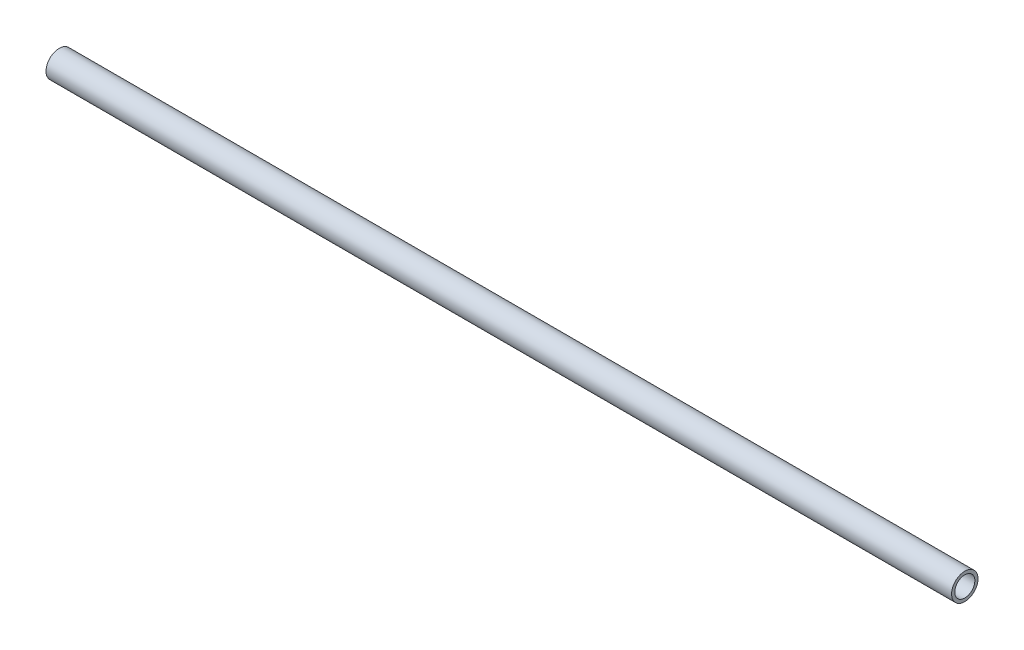
ISO-10303-21;
HEADER;
FILE_DESCRIPTION(('STEP AP214'),'2;1');
FILE_NAME('part.step','',(''),(''),'','','');
FILE_SCHEMA(('AUTOMOTIVE_DESIGN { 1 0 10303 214 1 1 1 1 }'));
ENDSEC;
DATA;
#1=APPLICATION_CONTEXT('core data for automotive mechanical design processes');
#2=APPLICATION_PROTOCOL_DEFINITION('international standard','automotive_design',2000,#1);
#3=PRODUCT_CONTEXT('',#1,'mechanical');
#4=PRODUCT('Part','Part','',(#3));
#5=PRODUCT_RELATED_PRODUCT_CATEGORY('part','',(#4));
#6=PRODUCT_DEFINITION_FORMATION('','',#4);
#7=PRODUCT_DEFINITION_CONTEXT('part definition',#1,'design');
#8=PRODUCT_DEFINITION('design','',#6,#7);
#9=PRODUCT_DEFINITION_SHAPE('','',#8);
#10=(LENGTH_UNIT() NAMED_UNIT(*) SI_UNIT(.MILLI.,.METRE.));
#11=(NAMED_UNIT(*) PLANE_ANGLE_UNIT() SI_UNIT($,.RADIAN.));
#12=(NAMED_UNIT(*) SI_UNIT($,.STERADIAN.) SOLID_ANGLE_UNIT());
#13=UNCERTAINTY_MEASURE_WITH_UNIT(LENGTH_MEASURE(1.E-05),#10,'distance_accuracy_value','');
#14=(GEOMETRIC_REPRESENTATION_CONTEXT(3) GLOBAL_UNCERTAINTY_ASSIGNED_CONTEXT((#13)) GLOBAL_UNIT_ASSIGNED_CONTEXT((#10,
#11,#12)) REPRESENTATION_CONTEXT('',''));
#15=CARTESIAN_POINT('',(0.,0.,0.));
#16=DIRECTION('',(0.,0.,1.));
#17=DIRECTION('',(1.,0.,0.));
#18=AXIS2_PLACEMENT_3D('',#15,#16,#17);
#19=CARTESIAN_POINT('',(870.,0.,0.));
#20=DIRECTION('',(1.,0.,0.));
#21=DIRECTION('',(0.,0.,-1.));
#22=AXIS2_PLACEMENT_3D('',#19,#20,#21);
#23=PLANE('',#22);
#24=CARTESIAN_POINT('',(870.,0.,0.));
#25=DIRECTION('',(1.,0.,0.));
#26=DIRECTION('',(0.,0.,-1.));
#27=AXIS2_PLACEMENT_3D('',#24,#25,#26);
#28=CIRCLE('',#27,12.7);
#29=CARTESIAN_POINT('',(870.,0.,12.7));
#30=VERTEX_POINT('',#29);
#31=EDGE_CURVE('E10',#30,#30,#28,.T.);
#32=ORIENTED_EDGE('',*,*,#31,.T.);
#33=EDGE_LOOP('',(#32));
#34=FACE_BOUND('',#33,.T.);
#35=CARTESIAN_POINT('',(870.,0.,0.));
#36=DIRECTION('',(1.,0.,0.));
#37=DIRECTION('',(0.,0.,-1.));
#38=AXIS2_PLACEMENT_3D('',#35,#36,#37);
#39=CIRCLE('',#38,9.652);
#40=CARTESIAN_POINT('',(870.,0.,9.652));
#41=VERTEX_POINT('',#40);
#42=EDGE_CURVE('E45',#41,#41,#39,.T.);
#43=ORIENTED_EDGE('',*,*,#42,.F.);
#44=EDGE_LOOP('',(#43));
#45=FACE_BOUND('',#44,.T.);
#46=ADVANCED_FACE('F34',(#34,#45),#23,.T.);
#47=CARTESIAN_POINT('',(0.,0.,0.));
#48=DIRECTION('',(1.,0.,0.));
#49=DIRECTION('',(0.,0.,-1.));
#50=AXIS2_PLACEMENT_3D('',#47,#48,#49);
#51=PLANE('',#50);
#52=CARTESIAN_POINT('',(0.,0.,0.));
#53=DIRECTION('',(1.,0.,0.));
#54=DIRECTION('',(0.,0.,-1.));
#55=AXIS2_PLACEMENT_3D('',#52,#53,#54);
#56=CIRCLE('',#55,12.7);
#57=CARTESIAN_POINT('',(0.,0.,12.7));
#58=VERTEX_POINT('',#57);
#59=EDGE_CURVE('E38',#58,#58,#56,.T.);
#60=ORIENTED_EDGE('',*,*,#59,.F.);
#61=EDGE_LOOP('',(#60));
#62=FACE_BOUND('',#61,.T.);
#63=CARTESIAN_POINT('',(0.,0.,0.));
#64=DIRECTION('',(1.,0.,0.));
#65=DIRECTION('',(0.,0.,-1.));
#66=AXIS2_PLACEMENT_3D('',#63,#64,#65);
#67=CIRCLE('',#66,9.652);
#68=CARTESIAN_POINT('',(0.,0.,9.652));
#69=VERTEX_POINT('',#68);
#70=EDGE_CURVE('E47',#69,#69,#67,.T.);
#71=ORIENTED_EDGE('',*,*,#70,.T.);
#72=EDGE_LOOP('',(#71));
#73=FACE_BOUND('',#72,.T.);
#74=ADVANCED_FACE('F57',(#62,#73),#51,.F.);
#75=CARTESIAN_POINT('',(870.,0.,0.));
#76=DIRECTION('',(-1.,0.,0.));
#77=DIRECTION('',(0.,0.,1.));
#78=AXIS2_PLACEMENT_3D('',#75,#76,#77);
#79=CYLINDRICAL_SURFACE('',#78,12.7);
#80=CARTESIAN_POINT('',(870.,0.,12.7));
#81=CARTESIAN_POINT('',(860.9375,0.,12.7));
#82=CARTESIAN_POINT('',(851.875,0.,12.7));
#83=CARTESIAN_POINT('',(833.75,0.,12.7));
#84=CARTESIAN_POINT('',(824.6875,0.,12.7));
#85=CARTESIAN_POINT('',(806.5625,0.,12.7));
#86=CARTESIAN_POINT('',(797.5,0.,12.7));
#87=CARTESIAN_POINT('',(779.375,0.,12.7));
#88=CARTESIAN_POINT('',(770.3125,0.,12.7));
#89=CARTESIAN_POINT('',(752.1875,0.,12.7));
#90=CARTESIAN_POINT('',(743.125,0.,12.7));
#91=CARTESIAN_POINT('',(725.,0.,12.7));
#92=CARTESIAN_POINT('',(715.9375,0.,12.7));
#93=CARTESIAN_POINT('',(697.8125,0.,12.7));
#94=CARTESIAN_POINT('',(688.75,0.,12.7));
#95=CARTESIAN_POINT('',(670.625,0.,12.7));
#96=CARTESIAN_POINT('',(661.5625,0.,12.7));
#97=CARTESIAN_POINT('',(643.4375,0.,12.7));
#98=CARTESIAN_POINT('',(634.375,0.,12.7));
#99=CARTESIAN_POINT('',(616.25,0.,12.7));
#100=CARTESIAN_POINT('',(607.1875,0.,12.7));
#101=CARTESIAN_POINT('',(589.0625,0.,12.7));
#102=CARTESIAN_POINT('',(580.,0.,12.7));
#103=CARTESIAN_POINT('',(561.875,0.,12.7));
#104=CARTESIAN_POINT('',(552.8125,0.,12.7));
#105=CARTESIAN_POINT('',(534.6875,0.,12.7));
#106=CARTESIAN_POINT('',(525.625,0.,12.7));
#107=CARTESIAN_POINT('',(507.5,0.,12.7));
#108=CARTESIAN_POINT('',(498.4375,0.,12.7));
#109=CARTESIAN_POINT('',(480.3125,0.,12.7));
#110=CARTESIAN_POINT('',(471.25,0.,12.7));
#111=CARTESIAN_POINT('',(453.125,0.,12.7));
#112=CARTESIAN_POINT('',(444.0625,0.,12.7));
#113=CARTESIAN_POINT('',(425.9375,0.,12.7));
#114=CARTESIAN_POINT('',(416.875,0.,12.7));
#115=CARTESIAN_POINT('',(398.75,0.,12.7));
#116=CARTESIAN_POINT('',(389.6875,0.,12.7));
#117=CARTESIAN_POINT('',(371.5625,0.,12.7));
#118=CARTESIAN_POINT('',(362.5,0.,12.7));
#119=CARTESIAN_POINT('',(344.375,0.,12.7));
#120=CARTESIAN_POINT('',(335.3125,0.,12.7));
#121=CARTESIAN_POINT('',(317.1875,0.,12.7));
#122=CARTESIAN_POINT('',(308.125,0.,12.7));
#123=CARTESIAN_POINT('',(290.,0.,12.7));
#124=CARTESIAN_POINT('',(280.9375,0.,12.7));
#125=CARTESIAN_POINT('',(262.8125,0.,12.7));
#126=CARTESIAN_POINT('',(253.75,0.,12.7));
#127=CARTESIAN_POINT('',(235.625,0.,12.7));
#128=CARTESIAN_POINT('',(226.5625,0.,12.7));
#129=CARTESIAN_POINT('',(208.4375,0.,12.7));
#130=CARTESIAN_POINT('',(199.375,0.,12.7));
#131=CARTESIAN_POINT('',(181.25,0.,12.7));
#132=CARTESIAN_POINT('',(172.1875,0.,12.7));
#133=CARTESIAN_POINT('',(154.0625,0.,12.7));
#134=CARTESIAN_POINT('',(145.,0.,12.7));
#135=CARTESIAN_POINT('',(126.875,0.,12.7));
#136=CARTESIAN_POINT('',(117.8125,0.,12.7));
#137=CARTESIAN_POINT('',(99.6875,0.,12.7));
#138=CARTESIAN_POINT('',(90.625,0.,12.7));
#139=CARTESIAN_POINT('',(72.5,0.,12.7));
#140=CARTESIAN_POINT('',(63.4375,0.,12.7));
#141=CARTESIAN_POINT('',(45.3125,0.,12.7));
#142=CARTESIAN_POINT('',(36.25,0.,12.7));
#143=CARTESIAN_POINT('',(18.125,0.,12.7));
#144=CARTESIAN_POINT('',(9.06250000000001,0.,12.7));
#145=CARTESIAN_POINT('',(0.,0.,12.7));
#146=B_SPLINE_CURVE_WITH_KNOTS('',3,(#80,#81,#82,#83,#84,#85,#86,#87,#88,#89,#90,#91,#92,#93,
#94,#95,#96,#97,#98,#99,#100,#101,#102,#103,#104,#105,#106,#107,#108,#109,#110,#111,#112,#113,
#114,#115,#116,#117,#118,#119,#120,#121,#122,#123,#124,#125,#126,#127,#128,#129,#130,#131,#132,
#133,#134,#135,#136,#137,#138,#139,#140,#141,#142,#143,#144,#145),.UNSPECIFIED.,.F.,.F.,(4,2,2,
2,2,2,2,2,2,2,2,2,2,2,2,2,2,2,2,2,2,2,2,2,2,2,2,2,2,2,2,2,4),(0.,27.1874999999999,54.375,
81.5625,108.75,135.9375,163.125,190.3125,217.5,244.6875,271.875,299.0625,326.25,353.4375,
380.625,407.8125,435.,462.1875,489.375,516.5625,543.75,570.9375,598.125,625.3125,652.5,679.6875,
706.875,734.0625,761.25,788.4375,815.625,842.8125,870.),.UNSPECIFIED.);
#147=EDGE_CURVE('BSEAM36',#30,#58,#146,.T.);
#148=ORIENTED_EDGE('',*,*,#31,.F.);
#149=ORIENTED_EDGE('',*,*,#59,.T.);
#150=ORIENTED_EDGE('',*,*,#147,.T.);
#151=ORIENTED_EDGE('',*,*,#147,.F.);
#152=EDGE_LOOP('',(#148,#150,#149,#151));
#153=FACE_BOUND('',#152,.T.);
#154=ADVANCED_FACE('F36',(#153),#79,.T.);
#155=CARTESIAN_POINT('',(870.,0.,0.));
#156=DIRECTION('',(-1.,0.,0.));
#157=DIRECTION('',(0.,0.,1.));
#158=AXIS2_PLACEMENT_3D('',#155,#156,#157);
#159=CYLINDRICAL_SURFACE('',#158,9.652);
#160=CARTESIAN_POINT('',(870.,0.,9.652));
#161=CARTESIAN_POINT('',(860.9375,0.,9.652));
#162=CARTESIAN_POINT('',(851.875,0.,9.652));
#163=CARTESIAN_POINT('',(833.75,0.,9.652));
#164=CARTESIAN_POINT('',(824.6875,0.,9.652));
#165=CARTESIAN_POINT('',(806.5625,0.,9.652));
#166=CARTESIAN_POINT('',(797.5,0.,9.652));
#167=CARTESIAN_POINT('',(779.375,0.,9.652));
#168=CARTESIAN_POINT('',(770.3125,0.,9.652));
#169=CARTESIAN_POINT('',(752.1875,0.,9.652));
#170=CARTESIAN_POINT('',(743.125,0.,9.652));
#171=CARTESIAN_POINT('',(725.,0.,9.652));
#172=CARTESIAN_POINT('',(715.9375,0.,9.652));
#173=CARTESIAN_POINT('',(697.8125,0.,9.652));
#174=CARTESIAN_POINT('',(688.75,0.,9.652));
#175=CARTESIAN_POINT('',(670.625,0.,9.652));
#176=CARTESIAN_POINT('',(661.5625,0.,9.652));
#177=CARTESIAN_POINT('',(643.4375,0.,9.652));
#178=CARTESIAN_POINT('',(634.375,0.,9.652));
#179=CARTESIAN_POINT('',(616.25,0.,9.652));
#180=CARTESIAN_POINT('',(607.1875,0.,9.652));
#181=CARTESIAN_POINT('',(589.0625,0.,9.652));
#182=CARTESIAN_POINT('',(580.,0.,9.652));
#183=CARTESIAN_POINT('',(561.875,0.,9.652));
#184=CARTESIAN_POINT('',(552.8125,0.,9.652));
#185=CARTESIAN_POINT('',(534.6875,0.,9.652));
#186=CARTESIAN_POINT('',(525.625,0.,9.652));
#187=CARTESIAN_POINT('',(507.5,0.,9.652));
#188=CARTESIAN_POINT('',(498.4375,0.,9.652));
#189=CARTESIAN_POINT('',(480.3125,0.,9.652));
#190=CARTESIAN_POINT('',(471.25,0.,9.652));
#191=CARTESIAN_POINT('',(453.125,0.,9.652));
#192=CARTESIAN_POINT('',(444.0625,0.,9.652));
#193=CARTESIAN_POINT('',(425.9375,0.,9.652));
#194=CARTESIAN_POINT('',(416.875,0.,9.652));
#195=CARTESIAN_POINT('',(398.75,0.,9.652));
#196=CARTESIAN_POINT('',(389.6875,0.,9.652));
#197=CARTESIAN_POINT('',(371.5625,0.,9.652));
#198=CARTESIAN_POINT('',(362.5,0.,9.652));
#199=CARTESIAN_POINT('',(344.375,0.,9.652));
#200=CARTESIAN_POINT('',(335.3125,0.,9.652));
#201=CARTESIAN_POINT('',(317.1875,0.,9.652));
#202=CARTESIAN_POINT('',(308.125,0.,9.652));
#203=CARTESIAN_POINT('',(290.,0.,9.652));
#204=CARTESIAN_POINT('',(280.9375,0.,9.652));
#205=CARTESIAN_POINT('',(262.8125,0.,9.652));
#206=CARTESIAN_POINT('',(253.75,0.,9.652));
#207=CARTESIAN_POINT('',(235.625,0.,9.652));
#208=CARTESIAN_POINT('',(226.5625,0.,9.652));
#209=CARTESIAN_POINT('',(208.4375,0.,9.652));
#210=CARTESIAN_POINT('',(199.375,0.,9.652));
#211=CARTESIAN_POINT('',(181.25,0.,9.652));
#212=CARTESIAN_POINT('',(172.1875,0.,9.652));
#213=CARTESIAN_POINT('',(154.0625,0.,9.652));
#214=CARTESIAN_POINT('',(145.,0.,9.652));
#215=CARTESIAN_POINT('',(126.875,0.,9.652));
#216=CARTESIAN_POINT('',(117.8125,0.,9.652));
#217=CARTESIAN_POINT('',(99.6875,0.,9.652));
#218=CARTESIAN_POINT('',(90.625,0.,9.652));
#219=CARTESIAN_POINT('',(72.5,0.,9.652));
#220=CARTESIAN_POINT('',(63.4375,0.,9.652));
#221=CARTESIAN_POINT('',(45.3125,0.,9.652));
#222=CARTESIAN_POINT('',(36.25,0.,9.652));
#223=CARTESIAN_POINT('',(18.125,0.,9.652));
#224=CARTESIAN_POINT('',(9.06250000000001,0.,9.652));
#225=CARTESIAN_POINT('',(0.,0.,9.652));
#226=B_SPLINE_CURVE_WITH_KNOTS('',3,(#160,#161,#162,#163,#164,#165,#166,#167,#168,#169,#170,
#171,#172,#173,#174,#175,#176,#177,#178,#179,#180,#181,#182,#183,#184,#185,#186,#187,#188,#189,
#190,#191,#192,#193,#194,#195,#196,#197,#198,#199,#200,#201,#202,#203,#204,#205,#206,#207,#208,
#209,#210,#211,#212,#213,#214,#215,#216,#217,#218,#219,#220,#221,#222,#223,#224,#225),
.UNSPECIFIED.,.F.,.F.,(4,2,2,2,2,2,2,2,2,2,2,2,2,2,2,2,2,2,2,2,2,2,2,2,2,2,2,2,2,2,2,2,4),(0.,
27.1874999999999,54.375,81.5625,108.75,135.9375,163.125,190.3125,217.5,244.6875,271.875,
299.0625,326.25,353.4375,380.625,407.8125,435.,462.1875,489.375,516.5625,543.75,570.9375,
598.125,625.3125,652.5,679.6875,706.875,734.0625,761.25,788.4375,815.625,842.8125,870.),.UNSPECIFIED.);
#227=EDGE_CURVE('BSEAM53',#41,#69,#226,.T.);
#228=ORIENTED_EDGE('',*,*,#42,.T.);
#229=ORIENTED_EDGE('',*,*,#70,.F.);
#230=ORIENTED_EDGE('',*,*,#227,.T.);
#231=ORIENTED_EDGE('',*,*,#227,.F.);
#232=EDGE_LOOP('',(#228,#230,#229,#231));
#233=FACE_BOUND('',#232,.T.);
#234=ADVANCED_FACE('F53',(#233),#159,.F.);
#235=CLOSED_SHELL('',(#46,#74,#154,#234));
#236=MANIFOLD_SOLID_BREP('B2',#235);
#237=ADVANCED_BREP_SHAPE_REPRESENTATION('',(#18,#236),#14);
#238=SHAPE_DEFINITION_REPRESENTATION(#9,#237);
ENDSEC;
END-ISO-10303-21;
